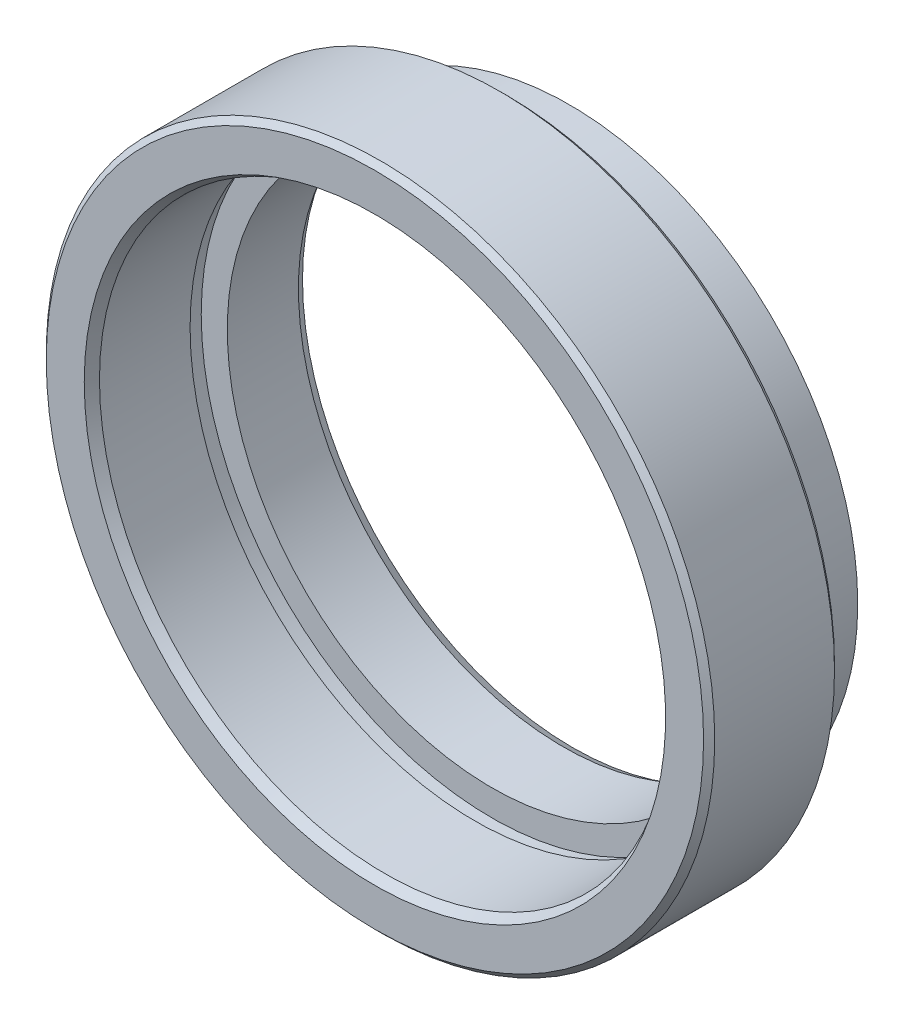
ISO-10303-21;
HEADER;
FILE_DESCRIPTION(('STEP AP214'),'2;1');
FILE_NAME('part.step','',(''),(''),'','','');
FILE_SCHEMA(('AUTOMOTIVE_DESIGN { 1 0 10303 214 1 1 1 1 }'));
ENDSEC;
DATA;
#1=APPLICATION_CONTEXT('core data for automotive mechanical design processes');
#2=APPLICATION_PROTOCOL_DEFINITION('international standard','automotive_design',2000,#1);
#3=PRODUCT_CONTEXT('',#1,'mechanical');
#4=PRODUCT('Part','Part','',(#3));
#5=PRODUCT_RELATED_PRODUCT_CATEGORY('part','',(#4));
#6=PRODUCT_DEFINITION_FORMATION('','',#4);
#7=PRODUCT_DEFINITION_CONTEXT('part definition',#1,'design');
#8=PRODUCT_DEFINITION('design','',#6,#7);
#9=PRODUCT_DEFINITION_SHAPE('','',#8);
#10=(LENGTH_UNIT() NAMED_UNIT(*) SI_UNIT(.MILLI.,.METRE.));
#11=(NAMED_UNIT(*) PLANE_ANGLE_UNIT() SI_UNIT($,.RADIAN.));
#12=(NAMED_UNIT(*) SI_UNIT($,.STERADIAN.) SOLID_ANGLE_UNIT());
#13=UNCERTAINTY_MEASURE_WITH_UNIT(LENGTH_MEASURE(1.E-05),#10,'distance_accuracy_value','');
#14=(GEOMETRIC_REPRESENTATION_CONTEXT(3) GLOBAL_UNCERTAINTY_ASSIGNED_CONTEXT((#13)) GLOBAL_UNIT_ASSIGNED_CONTEXT((#10,
#11,#12)) REPRESENTATION_CONTEXT('',''));
#15=CARTESIAN_POINT('',(0.,0.,0.));
#16=DIRECTION('',(0.,0.,1.));
#17=DIRECTION('',(1.,0.,0.));
#18=AXIS2_PLACEMENT_3D('',#15,#16,#17);
#19=CARTESIAN_POINT('',(0.,0.,-4.5085));
#20=DIRECTION('',(0.,0.,1.));
#21=DIRECTION('',(1.,0.,0.));
#22=AXIS2_PLACEMENT_3D('',#19,#20,#21);
#23=CYLINDRICAL_SURFACE('',#22,12.065);
#24=CARTESIAN_POINT('',(0.,0.,-4.06855909487749));
#25=DIRECTION('',(0.,0.,1.));
#26=DIRECTION('',(1.,0.,0.));
#27=AXIS2_PLACEMENT_3D('',#24,#25,#26);
#28=CIRCLE('',#27,12.065);
#29=CARTESIAN_POINT('',(12.065,0.,-4.06855909487749));
#30=VERTEX_POINT('',#29);
#31=EDGE_CURVE('E26',#30,#30,#28,.F.);
#32=ORIENTED_EDGE('',*,*,#31,.T.);
#33=EDGE_LOOP('',(#32));
#34=FACE_BOUND('',#33,.T.);
#35=CARTESIAN_POINT('',(0.,0.,-0.825499999999999));
#36=DIRECTION('',(0.,0.,1.));
#37=DIRECTION('',(1.,0.,0.));
#38=AXIS2_PLACEMENT_3D('',#35,#36,#37);
#39=CIRCLE('',#38,12.065);
#40=CARTESIAN_POINT('',(12.065,0.,-0.825499999999999));
#41=VERTEX_POINT('',#40);
#42=EDGE_CURVE('E35',#41,#41,#39,.F.);
#43=ORIENTED_EDGE('',*,*,#42,.F.);
#44=EDGE_LOOP('',(#43));
#45=FACE_BOUND('',#44,.T.);
#46=ADVANCED_FACE('F14',(#34,#45),#23,.F.);
#47=CARTESIAN_POINT('',(0.,13.1445,-2.2225));
#48=DIRECTION('',(0.,0.,-1.));
#49=DIRECTION('',(-1.,0.,0.));
#50=AXIS2_PLACEMENT_3D('',#47,#48,#49);
#51=PLANE('',#50);
#52=CARTESIAN_POINT('',(0.,0.,-2.2225));
#53=DIRECTION('',(0.,0.,1.));
#54=DIRECTION('',(1.,0.,0.));
#55=AXIS2_PLACEMENT_3D('',#52,#53,#54);
#56=CIRCLE('',#55,12.8905);
#57=CARTESIAN_POINT('',(12.8905,0.,-2.2225));
#58=VERTEX_POINT('',#57);
#59=EDGE_CURVE('E38',#58,#58,#56,.T.);
#60=ORIENTED_EDGE('',*,*,#59,.F.);
#61=EDGE_LOOP('',(#60));
#62=FACE_BOUND('',#61,.T.);
#63=CARTESIAN_POINT('',(0.,0.,-2.2225));
#64=DIRECTION('',(0.,0.,1.));
#65=DIRECTION('',(1.,0.,0.));
#66=AXIS2_PLACEMENT_3D('',#63,#64,#65);
#67=CIRCLE('',#66,13.1445);
#68=CARTESIAN_POINT('',(13.1445,0.,-2.2225));
#69=VERTEX_POINT('',#68);
#70=EDGE_CURVE('E34',#69,#69,#67,.T.);
#71=ORIENTED_EDGE('',*,*,#70,.T.);
#72=EDGE_LOOP('',(#71));
#73=FACE_BOUND('',#72,.T.);
#74=ADVANCED_FACE('F91',(#62,#73),#51,.F.);
#75=CARTESIAN_POINT('',(0.,0.,10.5671949058791));
#76=DIRECTION('',(0.,0.,1.));
#77=DIRECTION('',(1.,0.,0.));
#78=AXIS2_PLACEMENT_3D('',#75,#76,#77);
#79=CYLINDRICAL_SURFACE('',#78,13.1445);
#80=ORIENTED_EDGE('',*,*,#70,.F.);
#81=EDGE_LOOP('',(#80));
#82=FACE_BOUND('',#81,.T.);
#83=CARTESIAN_POINT('',(0.,0.,-4.36185303162583));
#84=DIRECTION('',(0.,0.,1.));
#85=DIRECTION('',(1.,0.,0.));
#86=AXIS2_PLACEMENT_3D('',#83,#84,#85);
#87=CIRCLE('',#86,13.1445);
#88=CARTESIAN_POINT('',(13.1445,0.,-4.36185303162583));
#89=VERTEX_POINT('',#88);
#90=EDGE_CURVE('E41',#89,#89,#87,.T.);
#91=ORIENTED_EDGE('',*,*,#90,.T.);
#92=EDGE_LOOP('',(#91));
#93=FACE_BOUND('',#92,.T.);
#94=ADVANCED_FACE('F97',(#82,#93),#79,.T.);
#95=CARTESIAN_POINT('',(0.,0.,-4.5085));
#96=DIRECTION('',(0.,0.,1.));
#97=DIRECTION('',(1.,0.,0.));
#98=AXIS2_PLACEMENT_3D('',#95,#96,#97);
#99=CONICAL_SURFACE('',#98,12.8905,1.0471975511966);
#100=ORIENTED_EDGE('',*,*,#90,.F.);
#101=EDGE_LOOP('',(#100));
#102=FACE_BOUND('',#101,.T.);
#103=CARTESIAN_POINT('',(0.,0.,-4.5085));
#104=DIRECTION('',(0.,0.,1.));
#105=DIRECTION('',(1.,0.,0.));
#106=AXIS2_PLACEMENT_3D('',#103,#104,#105);
#107=CIRCLE('',#106,12.8905);
#108=CARTESIAN_POINT('',(12.8905,0.,-4.5085));
#109=VERTEX_POINT('',#108);
#110=EDGE_CURVE('E44',#109,#109,#107,.T.);
#111=ORIENTED_EDGE('',*,*,#110,.T.);
#112=EDGE_LOOP('',(#111));
#113=FACE_BOUND('',#112,.T.);
#114=ADVANCED_FACE('F131',(#102,#113),#99,.T.);
#115=CARTESIAN_POINT('',(0.,12.8905,-4.5085));
#116=DIRECTION('',(0.,0.,1.));
#117=DIRECTION('',(1.,0.,0.));
#118=AXIS2_PLACEMENT_3D('',#115,#116,#117);
#119=PLANE('',#118);
#120=CARTESIAN_POINT('',(0.,0.,-4.5085));
#121=DIRECTION('',(0.,0.,1.));
#122=DIRECTION('',(1.,0.,0.));
#123=AXIS2_PLACEMENT_3D('',#120,#121,#122);
#124=CIRCLE('',#123,12.319);
#125=CARTESIAN_POINT('',(12.319,0.,-4.5085));
#126=VERTEX_POINT('',#125);
#127=EDGE_CURVE('E31',#126,#126,#124,.T.);
#128=ORIENTED_EDGE('',*,*,#127,.T.);
#129=EDGE_LOOP('',(#128));
#130=FACE_BOUND('',#129,.T.);
#131=ORIENTED_EDGE('',*,*,#110,.F.);
#132=EDGE_LOOP('',(#131));
#133=FACE_BOUND('',#132,.T.);
#134=ADVANCED_FACE('F128',(#130,#133),#119,.F.);
#135=CARTESIAN_POINT('',(0.,14.986,4.5085));
#136=DIRECTION('',(0.,0.,-1.));
#137=DIRECTION('',(-1.,0.,0.));
#138=AXIS2_PLACEMENT_3D('',#135,#136,#137);
#139=PLANE('',#138);
#140=CARTESIAN_POINT('',(0.,0.,4.5085));
#141=DIRECTION('',(0.,0.,-1.));
#142=DIRECTION('',(-1.,0.,0.));
#143=AXIS2_PLACEMENT_3D('',#140,#141,#142);
#144=CIRCLE('',#143,13.254);
#145=CARTESIAN_POINT('',(-13.254,0.,4.5085));
#146=VERTEX_POINT('',#145);
#147=EDGE_CURVE('E10',#146,#146,#144,.T.);
#148=ORIENTED_EDGE('',*,*,#147,.T.);
#149=EDGE_LOOP('',(#148));
#150=FACE_BOUND('',#149,.T.);
#151=CARTESIAN_POINT('',(0.,0.,4.5085));
#152=DIRECTION('',(0.,0.,1.));
#153=DIRECTION('',(1.,0.,0.));
#154=AXIS2_PLACEMENT_3D('',#151,#152,#153);
#155=CIRCLE('',#154,14.986);
#156=CARTESIAN_POINT('',(14.986,0.,4.5085));
#157=VERTEX_POINT('',#156);
#158=EDGE_CURVE('E47',#157,#157,#155,.T.);
#159=ORIENTED_EDGE('',*,*,#158,.T.);
#160=EDGE_LOOP('',(#159));
#161=FACE_BOUND('',#160,.T.);
#162=ADVANCED_FACE('F124',(#150,#161),#139,.F.);
#163=CARTESIAN_POINT('',(0.,0.,4.25449999999999));
#164=DIRECTION('',(0.,0.,-1.));
#165=DIRECTION('',(-1.,0.,0.));
#166=AXIS2_PLACEMENT_3D('',#163,#164,#165);
#167=CONICAL_SURFACE('',#166,15.24,0.785398163397448);
#168=ORIENTED_EDGE('',*,*,#158,.F.);
#169=EDGE_LOOP('',(#168));
#170=FACE_BOUND('',#169,.T.);
#171=CARTESIAN_POINT('',(0.,0.,4.25449999999999));
#172=DIRECTION('',(0.,0.,1.));
#173=DIRECTION('',(1.,0.,0.));
#174=AXIS2_PLACEMENT_3D('',#171,#172,#173);
#175=CIRCLE('',#174,15.24);
#176=CARTESIAN_POINT('',(15.24,0.,4.25449999999999));
#177=VERTEX_POINT('',#176);
#178=EDGE_CURVE('E50',#177,#177,#175,.T.);
#179=ORIENTED_EDGE('',*,*,#178,.T.);
#180=EDGE_LOOP('',(#179));
#181=FACE_BOUND('',#180,.T.);
#182=ADVANCED_FACE('F120',(#170,#181),#167,.T.);
#183=CARTESIAN_POINT('',(0.,0.,10.5671949058791));
#184=DIRECTION('',(0.,0.,1.));
#185=DIRECTION('',(1.,0.,0.));
#186=AXIS2_PLACEMENT_3D('',#183,#184,#185);
#187=CYLINDRICAL_SURFACE('',#186,15.24);
#188=ORIENTED_EDGE('',*,*,#178,.F.);
#189=EDGE_LOOP('',(#188));
#190=FACE_BOUND('',#189,.T.);
#191=CARTESIAN_POINT('',(0.,0.,-1.20649999999999));
#192=DIRECTION('',(0.,0.,1.));
#193=DIRECTION('',(1.,0.,0.));
#194=AXIS2_PLACEMENT_3D('',#191,#192,#193);
#195=CIRCLE('',#194,15.24);
#196=CARTESIAN_POINT('',(15.24,0.,-1.20649999999999));
#197=VERTEX_POINT('',#196);
#198=EDGE_CURVE('E53',#197,#197,#195,.T.);
#199=ORIENTED_EDGE('',*,*,#198,.T.);
#200=EDGE_LOOP('',(#199));
#201=FACE_BOUND('',#200,.T.);
#202=ADVANCED_FACE('F116',(#190,#201),#187,.T.);
#203=CARTESIAN_POINT('',(0.,0.,-1.4605));
#204=DIRECTION('',(0.,0.,1.));
#205=DIRECTION('',(1.,0.,0.));
#206=AXIS2_PLACEMENT_3D('',#203,#204,#205);
#207=CONICAL_SURFACE('',#206,14.986,0.785398163397452);
#208=ORIENTED_EDGE('',*,*,#198,.F.);
#209=EDGE_LOOP('',(#208));
#210=FACE_BOUND('',#209,.T.);
#211=CARTESIAN_POINT('',(0.,0.,-1.4605));
#212=DIRECTION('',(0.,0.,1.));
#213=DIRECTION('',(1.,0.,0.));
#214=AXIS2_PLACEMENT_3D('',#211,#212,#213);
#215=CIRCLE('',#214,14.986);
#216=CARTESIAN_POINT('',(14.986,0.,-1.4605));
#217=VERTEX_POINT('',#216);
#218=EDGE_CURVE('E56',#217,#217,#215,.T.);
#219=ORIENTED_EDGE('',*,*,#218,.T.);
#220=EDGE_LOOP('',(#219));
#221=FACE_BOUND('',#220,.T.);
#222=ADVANCED_FACE('F112',(#210,#221),#207,.T.);
#223=CARTESIAN_POINT('',(0.,14.986,-1.4605));
#224=DIRECTION('',(0.,0.,1.));
#225=DIRECTION('',(1.,0.,0.));
#226=AXIS2_PLACEMENT_3D('',#223,#224,#225);
#227=PLANE('',#226);
#228=ORIENTED_EDGE('',*,*,#218,.F.);
#229=EDGE_LOOP('',(#228));
#230=FACE_BOUND('',#229,.T.);
#231=CARTESIAN_POINT('',(0.,0.,-1.4605));
#232=DIRECTION('',(0.,0.,1.));
#233=DIRECTION('',(1.,0.,0.));
#234=AXIS2_PLACEMENT_3D('',#231,#232,#233);
#235=CIRCLE('',#234,12.8905);
#236=CARTESIAN_POINT('',(12.8905,0.,-1.4605));
#237=VERTEX_POINT('',#236);
#238=EDGE_CURVE('E59',#237,#237,#235,.T.);
#239=ORIENTED_EDGE('',*,*,#238,.T.);
#240=EDGE_LOOP('',(#239));
#241=FACE_BOUND('',#240,.T.);
#242=ADVANCED_FACE('F108',(#230,#241),#227,.F.);
#243=CARTESIAN_POINT('',(0.,0.,10.5671949058791));
#244=DIRECTION('',(0.,0.,1.));
#245=DIRECTION('',(1.,0.,0.));
#246=AXIS2_PLACEMENT_3D('',#243,#244,#245);
#247=CYLINDRICAL_SURFACE('',#246,12.8905);
#248=ORIENTED_EDGE('',*,*,#238,.F.);
#249=EDGE_LOOP('',(#248));
#250=FACE_BOUND('',#249,.T.);
#251=ORIENTED_EDGE('',*,*,#59,.T.);
#252=EDGE_LOOP('',(#251));
#253=FACE_BOUND('',#252,.T.);
#254=ADVANCED_FACE('F104',(#250,#253),#247,.T.);
#255=CARTESIAN_POINT('',(0.,0.,-0.825499999999999));
#256=DIRECTION('',(0.,0.,1.));
#257=DIRECTION('',(1.,0.,0.));
#258=AXIS2_PLACEMENT_3D('',#255,#256,#257);
#259=PLANE('',#258);
#260=ORIENTED_EDGE('',*,*,#42,.T.);
#261=EDGE_LOOP('',(#260));
#262=FACE_BOUND('',#261,.T.);
#263=CARTESIAN_POINT('',(0.,0.,-0.825499999999999));
#264=DIRECTION('',(0.,0.,1.));
#265=DIRECTION('',(1.,0.,0.));
#266=AXIS2_PLACEMENT_3D('',#263,#264,#265);
#267=CIRCLE('',#266,13.254000035);
#268=CARTESIAN_POINT('',(-13.254000035,0.,-0.825499999999999));
#269=VERTEX_POINT('',#268);
#270=EDGE_CURVE('E64',#269,#269,#267,.T.);
#271=ORIENTED_EDGE('',*,*,#270,.T.);
#272=EDGE_LOOP('',(#271));
#273=FACE_BOUND('',#272,.T.);
#274=ADVANCED_FACE('F107',(#262,#273),#259,.T.);
#275=CARTESIAN_POINT('',(0.,0.,-0.825499999999999));
#276=DIRECTION('',(0.,0.,1.));
#277=DIRECTION('',(1.,0.,0.));
#278=AXIS2_PLACEMENT_3D('',#275,#276,#277);
#279=CYLINDRICAL_SURFACE('',#278,13.);
#280=CARTESIAN_POINT('',(0.,0.,-0.063499999999999));
#281=DIRECTION('',(0.,0.,1.));
#282=DIRECTION('',(1.,0.,0.));
#283=AXIS2_PLACEMENT_3D('',#280,#281,#282);
#284=CIRCLE('',#283,13.);
#285=CARTESIAN_POINT('',(13.,0.,-0.063499999999999));
#286=VERTEX_POINT('',#285);
#287=EDGE_CURVE('E18',#286,#286,#284,.F.);
#288=ORIENTED_EDGE('',*,*,#287,.T.);
#289=EDGE_LOOP('',(#288));
#290=FACE_BOUND('',#289,.T.);
#291=CARTESIAN_POINT('',(0.,0.,4.06855909487749));
#292=DIRECTION('',(0.,0.,-1.));
#293=DIRECTION('',(-1.,0.,0.));
#294=AXIS2_PLACEMENT_3D('',#291,#292,#293);
#295=CIRCLE('',#294,13.);
#296=CARTESIAN_POINT('',(-13.,0.,4.06855909487749));
#297=VERTEX_POINT('',#296);
#298=EDGE_CURVE('E22',#297,#297,#295,.F.);
#299=ORIENTED_EDGE('',*,*,#298,.T.);
#300=EDGE_LOOP('',(#299));
#301=FACE_BOUND('',#300,.T.);
#302=ADVANCED_FACE('F74',(#290,#301),#279,.F.);
#303=CARTESIAN_POINT('',(0.,0.,-4.5085));
#304=DIRECTION('',(0.,0.,-1.));
#305=DIRECTION('',(-1.,0.,0.));
#306=AXIS2_PLACEMENT_3D('',#303,#304,#305);
#307=CONICAL_SURFACE('',#306,12.319,0.523598775598297);
#308=ORIENTED_EDGE('',*,*,#31,.F.);
#309=EDGE_LOOP('',(#308));
#310=FACE_BOUND('',#309,.T.);
#311=ORIENTED_EDGE('',*,*,#127,.F.);
#312=EDGE_LOOP('',(#311));
#313=FACE_BOUND('',#312,.T.);
#314=ADVANCED_FACE('F88',(#310,#313),#307,.F.);
#315=CARTESIAN_POINT('',(0.,0.,4.06855909487749));
#316=DIRECTION('',(0.,0.,1.));
#317=DIRECTION('',(1.,0.,0.));
#318=AXIS2_PLACEMENT_3D('',#315,#316,#317);
#319=CONICAL_SURFACE('',#318,13.,0.523598775598299);
#320=ORIENTED_EDGE('',*,*,#147,.F.);
#321=EDGE_LOOP('',(#320));
#322=FACE_BOUND('',#321,.T.);
#323=ORIENTED_EDGE('',*,*,#298,.F.);
#324=EDGE_LOOP('',(#323));
#325=FACE_BOUND('',#324,.T.);
#326=ADVANCED_FACE('F16',(#322,#325),#319,.F.);
#327=CARTESIAN_POINT('',(0.,0.,-0.063499999999999));
#328=DIRECTION('',(0.,0.,1.));
#329=DIRECTION('',(1.,0.,0.));
#330=AXIS2_PLACEMENT_3D('',#327,#328,#329);
#331=PLANE('',#330);
#332=CARTESIAN_POINT('',(0.,0.,-0.063499999999999));
#333=DIRECTION('',(0.,0.,1.));
#334=DIRECTION('',(1.,0.,0.));
#335=AXIS2_PLACEMENT_3D('',#332,#333,#334);
#336=CIRCLE('',#335,13.254000035);
#337=CARTESIAN_POINT('',(-13.254000035,0.,-0.063499999999999));
#338=VERTEX_POINT('',#337);
#339=EDGE_CURVE('E67',#338,#338,#336,.T.);
#340=ORIENTED_EDGE('',*,*,#339,.F.);
#341=EDGE_LOOP('',(#340));
#342=FACE_BOUND('',#341,.T.);
#343=ORIENTED_EDGE('',*,*,#287,.F.);
#344=EDGE_LOOP('',(#343));
#345=FACE_BOUND('',#344,.T.);
#346=ADVANCED_FACE('F77',(#342,#345),#331,.F.);
#347=CARTESIAN_POINT('',(0.,0.,-0.063499999999999));
#348=DIRECTION('',(0.,0.,-1.));
#349=DIRECTION('',(-1.,0.,0.));
#350=AXIS2_PLACEMENT_3D('',#347,#348,#349);
#351=CYLINDRICAL_SURFACE('',#350,13.254000035);
#352=CARTESIAN_POINT('',(-13.254000035,0.,-0.063499999999999));
#353=CARTESIAN_POINT('',(-13.254000035,0.,-0.071437499999999));
#354=CARTESIAN_POINT('',(-13.254000035,0.,-0.079374999999999));
#355=CARTESIAN_POINT('',(-13.254000035,0.,-0.095249999999999));
#356=CARTESIAN_POINT('',(-13.254000035,0.,-0.103187499999999));
#357=CARTESIAN_POINT('',(-13.254000035,0.,-0.119062499999999));
#358=CARTESIAN_POINT('',(-13.254000035,0.,-0.126999999999999));
#359=CARTESIAN_POINT('',(-13.254000035,0.,-0.142874999999999));
#360=CARTESIAN_POINT('',(-13.254000035,0.,-0.150812499999999));
#361=CARTESIAN_POINT('',(-13.254000035,0.,-0.166687499999999));
#362=CARTESIAN_POINT('',(-13.254000035,0.,-0.174624999999999));
#363=CARTESIAN_POINT('',(-13.254000035,0.,-0.190499999999999));
#364=CARTESIAN_POINT('',(-13.254000035,0.,-0.198437499999999));
#365=CARTESIAN_POINT('',(-13.254000035,0.,-0.214312499999999));
#366=CARTESIAN_POINT('',(-13.254000035,0.,-0.222249999999999));
#367=CARTESIAN_POINT('',(-13.254000035,0.,-0.238124999999999));
#368=CARTESIAN_POINT('',(-13.254000035,0.,-0.246062499999999));
#369=CARTESIAN_POINT('',(-13.254000035,0.,-0.261937499999999));
#370=CARTESIAN_POINT('',(-13.254000035,0.,-0.269874999999999));
#371=CARTESIAN_POINT('',(-13.254000035,0.,-0.285749999999999));
#372=CARTESIAN_POINT('',(-13.254000035,0.,-0.293687499999999));
#373=CARTESIAN_POINT('',(-13.254000035,0.,-0.309562499999999));
#374=CARTESIAN_POINT('',(-13.254000035,0.,-0.317499999999999));
#375=CARTESIAN_POINT('',(-13.254000035,0.,-0.333374999999999));
#376=CARTESIAN_POINT('',(-13.254000035,0.,-0.341312499999999));
#377=CARTESIAN_POINT('',(-13.254000035,0.,-0.357187499999999));
#378=CARTESIAN_POINT('',(-13.254000035,0.,-0.365124999999999));
#379=CARTESIAN_POINT('',(-13.254000035,0.,-0.380999999999999));
#380=CARTESIAN_POINT('',(-13.254000035,0.,-0.388937499999999));
#381=CARTESIAN_POINT('',(-13.254000035,0.,-0.404812499999999));
#382=CARTESIAN_POINT('',(-13.254000035,0.,-0.412749999999999));
#383=CARTESIAN_POINT('',(-13.254000035,0.,-0.428624999999999));
#384=CARTESIAN_POINT('',(-13.254000035,0.,-0.436562499999999));
#385=CARTESIAN_POINT('',(-13.254000035,0.,-0.452437499999999));
#386=CARTESIAN_POINT('',(-13.254000035,0.,-0.460374999999999));
#387=CARTESIAN_POINT('',(-13.254000035,0.,-0.476249999999999));
#388=CARTESIAN_POINT('',(-13.254000035,0.,-0.484187499999999));
#389=CARTESIAN_POINT('',(-13.254000035,0.,-0.500062499999999));
#390=CARTESIAN_POINT('',(-13.254000035,0.,-0.507999999999999));
#391=CARTESIAN_POINT('',(-13.254000035,0.,-0.523874999999999));
#392=CARTESIAN_POINT('',(-13.254000035,0.,-0.531812499999999));
#393=CARTESIAN_POINT('',(-13.254000035,0.,-0.547687499999999));
#394=CARTESIAN_POINT('',(-13.254000035,0.,-0.555624999999999));
#395=CARTESIAN_POINT('',(-13.254000035,0.,-0.571499999999999));
#396=CARTESIAN_POINT('',(-13.254000035,0.,-0.579437499999999));
#397=CARTESIAN_POINT('',(-13.254000035,0.,-0.595312499999999));
#398=CARTESIAN_POINT('',(-13.254000035,0.,-0.603249999999999));
#399=CARTESIAN_POINT('',(-13.254000035,0.,-0.619124999999999));
#400=CARTESIAN_POINT('',(-13.254000035,0.,-0.627062499999999));
#401=CARTESIAN_POINT('',(-13.254000035,0.,-0.642937499999999));
#402=CARTESIAN_POINT('',(-13.254000035,0.,-0.650874999999999));
#403=CARTESIAN_POINT('',(-13.254000035,0.,-0.666749999999999));
#404=CARTESIAN_POINT('',(-13.254000035,0.,-0.674687499999999));
#405=CARTESIAN_POINT('',(-13.254000035,0.,-0.690562499999999));
#406=CARTESIAN_POINT('',(-13.254000035,0.,-0.698499999999999));
#407=CARTESIAN_POINT('',(-13.254000035,0.,-0.714374999999999));
#408=CARTESIAN_POINT('',(-13.254000035,0.,-0.722312499999999));
#409=CARTESIAN_POINT('',(-13.254000035,0.,-0.738187499999999));
#410=CARTESIAN_POINT('',(-13.254000035,0.,-0.746124999999999));
#411=CARTESIAN_POINT('',(-13.254000035,0.,-0.761999999999999));
#412=CARTESIAN_POINT('',(-13.254000035,0.,-0.769937499999999));
#413=CARTESIAN_POINT('',(-13.254000035,0.,-0.785812499999999));
#414=CARTESIAN_POINT('',(-13.254000035,0.,-0.793749999999999));
#415=CARTESIAN_POINT('',(-13.254000035,0.,-0.809624999999999));
#416=CARTESIAN_POINT('',(-13.254000035,0.,-0.817562499999999));
#417=CARTESIAN_POINT('',(-13.254000035,0.,-0.825499999999999));
#418=B_SPLINE_CURVE_WITH_KNOTS('',3,(#352,#353,#354,#355,#356,#357,#358,#359,#360,#361,#362,
#363,#364,#365,#366,#367,#368,#369,#370,#371,#372,#373,#374,#375,#376,#377,#378,#379,#380,#381,
#382,#383,#384,#385,#386,#387,#388,#389,#390,#391,#392,#393,#394,#395,#396,#397,#398,#399,#400,
#401,#402,#403,#404,#405,#406,#407,#408,#409,#410,#411,#412,#413,#414,#415,#416,#417),
.UNSPECIFIED.,.F.,.F.,(4,2,2,2,2,2,2,2,2,2,2,2,2,2,2,2,2,2,2,2,2,2,2,2,2,2,2,2,2,2,2,2,4),(0.,
0.0238125,0.047625,0.0714375,0.09525,0.1190625,0.142875,0.1666875,0.1905,0.2143125,0.238125,
0.2619375,0.28575,0.3095625,0.333375,0.3571875,0.381,0.4048125,0.428625,0.4524375,0.47625,
0.5000625,0.523875,0.5476875,0.5715,0.5953125,0.619125,0.6429375,0.66675,0.6905625,0.714375,
0.7381875,0.762),.UNSPECIFIED.);
#419=EDGE_CURVE('BSEAM79',#338,#269,#418,.T.);
#420=ORIENTED_EDGE('',*,*,#339,.T.);
#421=ORIENTED_EDGE('',*,*,#270,.F.);
#422=ORIENTED_EDGE('',*,*,#419,.T.);
#423=ORIENTED_EDGE('',*,*,#419,.F.);
#424=EDGE_LOOP('',(#420,#422,#421,#423));
#425=FACE_BOUND('',#424,.T.);
#426=ADVANCED_FACE('F79',(#425),#351,.F.);
#427=CLOSED_SHELL('',(#46,#74,#94,#114,#134,#162,#182,#202,#222,#242,#254,#274,#302,#314,#326,
#346,#426));
#428=MANIFOLD_SOLID_BREP('B1',#427);
#429=ADVANCED_BREP_SHAPE_REPRESENTATION('',(#18,#428),#14);
#430=SHAPE_DEFINITION_REPRESENTATION(#9,#429);
ENDSEC;
END-ISO-10303-21;
